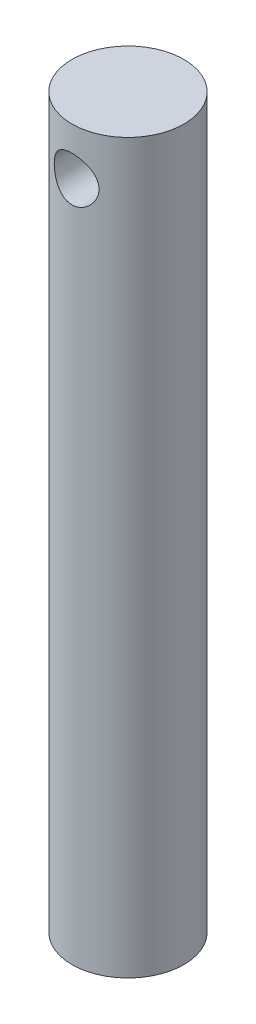
ISO-10303-21;
HEADER;
FILE_DESCRIPTION(('STEP AP214'),'2;1');
FILE_NAME('part.step','',(''),(''),'','','');
FILE_SCHEMA(('AUTOMOTIVE_DESIGN { 1 0 10303 214 1 1 1 1 }'));
ENDSEC;
DATA;
#1=APPLICATION_CONTEXT('core data for automotive mechanical design processes');
#2=APPLICATION_PROTOCOL_DEFINITION('international standard','automotive_design',2000,#1);
#3=PRODUCT_CONTEXT('',#1,'mechanical');
#4=PRODUCT('Part','Part','',(#3));
#5=PRODUCT_RELATED_PRODUCT_CATEGORY('part','',(#4));
#6=PRODUCT_DEFINITION_FORMATION('','',#4);
#7=PRODUCT_DEFINITION_CONTEXT('part definition',#1,'design');
#8=PRODUCT_DEFINITION('design','',#6,#7);
#9=PRODUCT_DEFINITION_SHAPE('','',#8);
#10=(LENGTH_UNIT() NAMED_UNIT(*) SI_UNIT(.MILLI.,.METRE.));
#11=(NAMED_UNIT(*) PLANE_ANGLE_UNIT() SI_UNIT($,.RADIAN.));
#12=(NAMED_UNIT(*) SI_UNIT($,.STERADIAN.) SOLID_ANGLE_UNIT());
#13=UNCERTAINTY_MEASURE_WITH_UNIT(LENGTH_MEASURE(1.E-05),#10,'distance_accuracy_value','');
#14=(GEOMETRIC_REPRESENTATION_CONTEXT(3) GLOBAL_UNCERTAINTY_ASSIGNED_CONTEXT((#13)) GLOBAL_UNIT_ASSIGNED_CONTEXT((#10,
#11,#12)) REPRESENTATION_CONTEXT('',''));
#15=CARTESIAN_POINT('',(0.,0.,0.));
#16=DIRECTION('',(0.,0.,1.));
#17=DIRECTION('',(1.,0.,0.));
#18=AXIS2_PLACEMENT_3D('',#15,#16,#17);
#19=CARTESIAN_POINT('',(0.,130.,0.));
#20=DIRECTION('',(0.,-1.,0.));
#21=DIRECTION('',(0.,0.,-1.));
#22=AXIS2_PLACEMENT_3D('',#19,#20,#21);
#23=CYLINDRICAL_SURFACE('',#22,10.);
#24=CARTESIAN_POINT('',(0.,125.5,-10.));
#25=CARTESIAN_POINT('',(-0.107549581345538,125.499998425067,-9.99999886871264));
#26=CARTESIAN_POINT('',(-0.215132147940364,125.49565632892,-9.99825999367799));
#27=CARTESIAN_POINT('',(-0.429535200549552,125.478326617216,-9.99134740691108));
#28=CARTESIAN_POINT('',(-0.536355162703305,125.465333546597,-9.98617152790588));
#29=CARTESIAN_POINT('',(-0.74863585649742,125.430791965449,-9.97250573560117));
#30=CARTESIAN_POINT('',(-0.854093134440873,125.40922494538,-9.96400865312144));
#31=CARTESIAN_POINT('',(-1.0626676111401,125.357758269563,-9.94393017211574));
#32=CARTESIAN_POINT('',(-1.1657838422726,125.327855233745,-9.932347522545));
#33=CARTESIAN_POINT('',(-1.46979509681069,125.226277191284,-9.89349112162205));
#34=CARTESIAN_POINT('',(-1.66629107461993,125.142578180994,-9.86204458846134));
#35=CARTESIAN_POINT('',(-2.04217417878102,124.94595378265,-9.79113035538708));
#36=CARTESIAN_POINT('',(-2.22156721456799,124.833038539885,-9.75166544086262));
#37=CARTESIAN_POINT('',(-2.56699339938209,124.575531245478,-9.66661825353092));
#38=CARTESIAN_POINT('',(-2.73212223266509,124.429787289424,-9.62084608086599));
#39=CARTESIAN_POINT('',(-3.03635232313264,124.113199390848,-9.52921139577231));
#40=CARTESIAN_POINT('',(-3.17544084661154,123.942343240983,-9.48334885017047));
#41=CARTESIAN_POINT('',(-3.42974847409894,123.571144031434,-9.39445587657958));
#42=CARTESIAN_POINT('',(-3.54362978572887,123.369827073936,-9.35164233015934));
#43=CARTESIAN_POINT('',(-3.73550961465234,122.948927157199,-9.2766729328807));
#44=CARTESIAN_POINT('',(-3.81352517485723,122.729352932259,-9.24451202207145));
#45=CARTESIAN_POINT('',(-3.92779760260542,122.288575344314,-9.19652715590089));
#46=CARTESIAN_POINT('',(-3.96578791979826,122.067897531912,-9.18002840771385));
#47=CARTESIAN_POINT('',(-4.00434593508728,121.622730000323,-9.16328008038142));
#48=CARTESIAN_POINT('',(-4.00493203570087,121.398242209989,-9.16302251073202));
#49=CARTESIAN_POINT('',(-3.9699787321474,120.968486657777,-9.17821000534301));
#50=CARTESIAN_POINT('',(-3.93695062778272,120.762968571234,-9.19256349925666));
#51=CARTESIAN_POINT('',(-3.83989376129508,120.36068088765,-9.23352375055553));
#52=CARTESIAN_POINT('',(-3.77585958980135,120.163912823694,-9.26013264599921));
#53=CARTESIAN_POINT('',(-3.61738946491141,119.779964327708,-9.32318970221162));
#54=CARTESIAN_POINT('',(-3.52235972457939,119.593061521918,-9.35982758573424));
#55=CARTESIAN_POINT('',(-3.30501292151569,119.23716836725,-9.43876232767927));
#56=CARTESIAN_POINT('',(-3.1826856102159,119.068184781187,-9.48106130910411));
#57=CARTESIAN_POINT('',(-2.90310119889356,118.739180542404,-9.57053473488081));
#58=CARTESIAN_POINT('',(-2.74387492593717,118.58086254111,-9.61783329953252));
#59=CARTESIAN_POINT('',(-2.40062885486449,118.292631043994,-9.70919649915615));
#60=CARTESIAN_POINT('',(-2.21660413066998,118.162723205179,-9.75326048890393));
#61=CARTESIAN_POINT('',(-1.82415530521056,117.932765105169,-9.83429362529358));
#62=CARTESIAN_POINT('',(-1.61532098269266,117.833355437606,-9.87110540190899));
#63=CARTESIAN_POINT('',(-1.18204753096606,117.671664277844,-9.93229656657448));
#64=CARTESIAN_POINT('',(-0.9576163936994,117.609363924885,-9.95668226924746));
#65=CARTESIAN_POINT('',(-0.513791775215592,117.527103409161,-9.98912279013839));
#66=CARTESIAN_POINT('',(-0.294886587971143,117.504855091493,-9.99805891667034));
#67=CARTESIAN_POINT('',(0.143690619615703,117.496573798943,-10.0013695702126));
#68=CARTESIAN_POINT('',(0.36336242644818,117.510531436905,-9.99574787164577));
#69=CARTESIAN_POINT('',(0.786865478243651,117.572583505104,-9.97115134127512));
#70=CARTESIAN_POINT('',(0.990964983549757,117.619115960703,-9.95278782691064));
#71=CARTESIAN_POINT('',(1.38827085612275,117.742871416619,-9.90518882810983));
#72=CARTESIAN_POINT('',(1.58147582045412,117.820098359335,-9.87595194712999));
#73=CARTESIAN_POINT('',(1.95815757162884,118.005569879362,-9.80833189541687));
#74=CARTESIAN_POINT('',(2.14115604549353,118.114690944095,-9.76969631959847));
#75=CARTESIAN_POINT('',(2.48688718251039,118.359880647803,-9.68746729490809));
#76=CARTESIAN_POINT('',(2.64961168158684,118.495960085814,-9.64387186219643));
#77=CARTESIAN_POINT('',(2.96144608598878,118.801740025933,-9.55290235277181));
#78=CARTESIAN_POINT('',(3.10894786734726,118.973067083141,-9.50546882853787));
#79=CARTESIAN_POINT('',(3.37350239509235,119.33888016589,-9.4148334583058));
#80=CARTESIAN_POINT('',(3.49055012366591,119.533370000199,-9.37163231039242));
#81=CARTESIAN_POINT('',(3.69161500286277,119.942923389673,-9.2942859982933));
#82=CARTESIAN_POINT('',(3.77530118531766,120.158168000244,-9.2602326182174));
#83=CARTESIAN_POINT('',(3.90459244315908,120.601467301613,-9.20647346903736));
#84=CARTESIAN_POINT('',(3.95022562452798,120.829512404842,-9.1867571119746));
#85=CARTESIAN_POINT('',(3.99943122157417,121.274255809844,-9.16543518780389));
#86=CARTESIAN_POINT('',(4.0057941177721,121.490589701895,-9.16262842667612));
#87=CARTESIAN_POINT('',(3.98360636538274,121.921089692721,-9.17229671415009));
#88=CARTESIAN_POINT('',(3.9550601501471,122.135256063282,-9.18476982225497));
#89=CARTESIAN_POINT('',(3.86614256488129,122.54666446089,-9.2225330048627));
#90=CARTESIAN_POINT('',(3.80707437387706,122.744240846221,-9.2472967218297));
#91=CARTESIAN_POINT('',(3.66001151041638,123.12675696179,-9.30647993934966));
#92=CARTESIAN_POINT('',(3.5720088493455,123.311693185111,-9.34090210615105));
#93=CARTESIAN_POINT('',(3.36374310804133,123.675220410709,-9.41797252826471));
#94=CARTESIAN_POINT('',(3.24192140926543,123.852841830688,-9.46097893410836));
#95=CARTESIAN_POINT('',(2.97179350239177,124.185982142625,-9.54927479921252));
#96=CARTESIAN_POINT('',(2.82347931168581,124.34149434729,-9.59456494363941));
#97=CARTESIAN_POINT('',(2.492974124467,124.636423592531,-9.68587647140964));
#98=CARTESIAN_POINT('',(2.30921017071956,124.774143383982,-9.73175488236393));
#99=CARTESIAN_POINT('',(2.01716584575535,124.956048108938,-9.7949502762577));
#100=CARTESIAN_POINT('',(1.91699501972426,125.012607063853,-9.81509269692655));
#101=CARTESIAN_POINT('',(1.71180110982481,125.117037995405,-9.85294835133019));
#102=CARTESIAN_POINT('',(1.60678027559743,125.164913949808,-9.87066269647665));
#103=CARTESIAN_POINT('',(1.3945464690433,125.250747984685,-9.9028559935491));
#104=CARTESIAN_POINT('',(1.28740777135874,125.288870154747,-9.91738778532477));
#105=CARTESIAN_POINT('',(1.06995577523385,125.355921347721,-9.94319722915714));
#106=CARTESIAN_POINT('',(0.959643983352636,125.38485465735,-9.95447639837582));
#107=CARTESIAN_POINT('',(0.736945215856851,125.433174836149,-9.97343330649399));
#108=CARTESIAN_POINT('',(0.624564263591296,125.452585911645,-9.98112017494336));
#109=CARTESIAN_POINT('',(0.398419132407617,125.481738570666,-9.99270031578293));
#110=CARTESIAN_POINT('',(0.284655994966365,125.491487026834,-9.99659628445551));
#111=CARTESIAN_POINT('',(0.113830463425499,125.498785895573,-9.99951445883957));
#112=CARTESIAN_POINT('',(0.0569198512645336,125.500000833522,-10.0000005987258));
#113=CARTESIAN_POINT('',(0.,125.5,-10.));
#114=B_SPLINE_CURVE_WITH_KNOTS('',3,(#24,#25,#26,#27,#28,#29,#30,#31,#32,#33,#34,#35,#36,#37,
#38,#39,#40,#41,#42,#43,#44,#45,#46,#47,#48,#49,#50,#51,#52,#53,#54,#55,#56,#57,#58,#59,#60,#61,
#62,#63,#64,#65,#66,#67,#68,#69,#70,#71,#72,#73,#74,#75,#76,#77,#78,#79,#80,#81,#82,#83,#84,#85,
#86,#87,#88,#89,#90,#91,#92,#93,#94,#95,#96,#97,#98,#99,#100,#101,#102,#103,#104,#105,#106,#107,
#108,#109,#110,#111,#112,#113),.UNSPECIFIED.,.T.,.F.,(4,2,2,2,2,2,2,2,2,2,2,2,2,2,2,2,2,2,2,2,2,
2,2,2,2,2,2,2,2,2,2,2,2,2,2,2,2,2,2,2,2,2,2,2,4),(0.,0.322603993422159,0.645411604786486,
0.968919914471237,1.29255959093095,1.93701523385824,2.58124739027476,3.25313995292302,
3.92536021760331,4.62749749529941,5.32930078128043,5.99927442509165,6.66891844572484,
7.29195888698823,7.91510806412271,8.55097484497808,9.18708075776543,9.87235930273289,
10.5577741757964,11.2567305822579,11.9553314412776,12.6125760095619,13.2696501904034,
13.8972014302891,14.5248332988777,15.171662586967,15.8187515089811,16.50856181149,
17.1984856998767,17.8950932218183,18.5911857719204,19.2371857868567,19.8831037702627,
20.5034786899772,21.124025035105,21.7801016801356,22.4363763459696,23.1352007896785,
23.4851924266232,23.8350233218042,24.1785111324565,24.52183846562,24.8642884495951,
25.2064946871486,25.3772305569977),.UNSPECIFIED.);
#115=CARTESIAN_POINT('',(0.,125.5,-10.));
#116=VERTEX_POINT('',#115);
#117=EDGE_CURVE('E32',#116,#116,#114,.T.);
#118=ORIENTED_EDGE('',*,*,#117,.T.);
#119=EDGE_LOOP('',(#118));
#120=FACE_BOUND('',#119,.T.);
#121=CARTESIAN_POINT('',(4.,121.5,9.16515138991168));
#122=CARTESIAN_POINT('',(3.99999917996685,121.392822503216,9.16515220722506));
#123=CARTESIAN_POINT('',(3.99568627578832,121.285612140205,9.16703782704588));
#124=CARTESIAN_POINT('',(3.97847804504316,121.071967905829,9.17451890581268));
#125=CARTESIAN_POINT('',(3.965577465543,120.965534550055,9.18011663538446));
#126=CARTESIAN_POINT('',(3.9312935770878,120.754064046644,9.19485078616074));
#127=CARTESIAN_POINT('',(3.90989336356572,120.649030115151,9.20399425848326));
#128=CARTESIAN_POINT('',(3.85883937208579,120.44131240281,9.2255144619826));
#129=CARTESIAN_POINT('',(3.82918216740128,120.338629616898,9.23789253541712));
#130=CARTESIAN_POINT('',(3.72849978450445,120.036010273371,9.27920231487636));
#131=CARTESIAN_POINT('',(3.64559228099563,119.840462079036,9.31238810193525));
#132=CARTESIAN_POINT('',(3.45083256453888,119.466198731327,9.38629512671437));
#133=CARTESIAN_POINT('',(3.33898667159604,119.287479914109,9.42701471853534));
#134=CARTESIAN_POINT('',(3.08264624953203,118.941488186399,9.51401677460926));
#135=CARTESIAN_POINT('',(2.93675933272146,118.775289566711,9.56047821792022));
#136=CARTESIAN_POINT('',(2.61941759406606,118.468939591958,9.65224928088017));
#137=CARTESIAN_POINT('',(2.44795387495429,118.328797339245,9.69755849326326));
#138=CARTESIAN_POINT('',(2.07601279575004,118.073187890163,9.78406811808173));
#139=CARTESIAN_POINT('',(1.87465797803874,117.958911580031,9.82503606295845));
#140=CARTESIAN_POINT('',(1.45365059895514,117.766312680323,9.89607856333948));
#141=CARTESIAN_POINT('',(1.23400552632834,117.687975460567,9.92615755049622));
#142=CARTESIAN_POINT('',(0.793932865332423,117.573317072677,9.97076649749865));
#143=CARTESIAN_POINT('',(0.574057972725518,117.535145384002,9.98597873479395));
#144=CARTESIAN_POINT('',(0.130532654160153,117.495943016499,10.001606214367));
#145=CARTESIAN_POINT('',(-0.0931163324631254,117.494898484956,10.0020269755724));
#146=CARTESIAN_POINT('',(-0.524464988663938,117.528965542546,9.98843925626005));
#147=CARTESIAN_POINT('',(-0.732354905542466,117.562049546297,9.97523993538891));
#148=CARTESIAN_POINT('',(-1.13934621864231,117.659985751818,9.93698582942363));
#149=CARTESIAN_POINT('',(-1.33844696883604,117.724840284584,9.91193017443785));
#150=CARTESIAN_POINT('',(-1.72579587696676,117.885272965972,9.85193648913816));
#151=CARTESIAN_POINT('',(-1.9138352467432,117.981299429689,9.81685520932147));
#152=CARTESIAN_POINT('',(-2.27161630149723,118.20093001378,9.7402917036085));
#153=CARTESIAN_POINT('',(-2.44135168543996,118.324543586184,9.69880728534381));
#154=CARTESIAN_POINT('',(-2.76953765597607,118.605298271905,9.61043274352156));
#155=CARTESIAN_POINT('',(-2.9265156905315,118.76410778515,9.56336653023493));
#156=CARTESIAN_POINT('',(-3.21221483078646,119.105981143659,9.47123321946549));
#157=CARTESIAN_POINT('',(-3.34092668757429,119.28905289639,9.42616678016159));
#158=CARTESIAN_POINT('',(-3.56980837743823,119.680838044749,9.34193794818039));
#159=CARTESIAN_POINT('',(-3.66906930327244,119.890129660678,9.30297828115413));
#160=CARTESIAN_POINT('',(-3.83035251973301,120.324430980624,9.23775180688171));
#161=CARTESIAN_POINT('',(-3.89239899675599,120.549430369453,9.21147675782622));
#162=CARTESIAN_POINT('',(-3.97390989770977,120.994071554935,9.17659519405432));
#163=CARTESIAN_POINT('',(-3.99574419362908,121.213200894257,9.16700732912275));
#164=CARTESIAN_POINT('',(-4.00312265288578,121.652154415519,9.16378995738077));
#165=CARTESIAN_POINT('',(-3.98867782118258,121.871978366551,9.17015561120724));
#166=CARTESIAN_POINT('',(-3.92606578958006,122.292917869914,9.19712088718227));
#167=CARTESIAN_POINT('',(-3.87986612404772,122.4943858748,9.21688915596603));
#168=CARTESIAN_POINT('',(-3.75760837382176,122.886576809571,9.26740102054679));
#169=CARTESIAN_POINT('',(-3.68154366860459,123.077297346215,9.29814704977195));
#170=CARTESIAN_POINT('',(-3.49827127896311,123.451204715591,9.36867563720203));
#171=CARTESIAN_POINT('',(-3.38992573652915,123.633772377387,9.40877409278357));
#172=CARTESIAN_POINT('',(-3.1463304488838,123.978965974885,9.49300770315587));
#173=CARTESIAN_POINT('',(-3.01106974696435,124.141583745598,9.5371444979208));
#174=CARTESIAN_POINT('',(-2.70568842336056,124.454746817191,9.62841831942843));
#175=CARTESIAN_POINT('',(-2.53373085888855,124.603513130555,9.67553614570507));
#176=CARTESIAN_POINT('',(-2.16616726673934,124.870354153248,9.76439589135024));
#177=CARTESIAN_POINT('',(-1.97056027694192,124.988427613297,9.80613759186121));
#178=CARTESIAN_POINT('',(-1.56055986799732,125.190095252819,9.87967431800929));
#179=CARTESIAN_POINT('',(-1.346170961965,125.273697687947,9.9114717248188));
#180=CARTESIAN_POINT('',(-0.904787181861567,125.403097705199,9.96145426937249));
#181=CARTESIAN_POINT('',(-0.677799220674797,125.448915804313,9.97964679410119));
#182=CARTESIAN_POINT('',(-0.233633020611972,125.499009401911,9.99958016425668));
#183=CARTESIAN_POINT('',(-0.0167809848943009,125.505800252077,10.0023169350655));
#184=CARTESIAN_POINT('',(0.414867671174727,125.48428904628,9.99372084740381));
#185=CARTESIAN_POINT('',(0.629664597702891,125.455992302479,9.98239011871255));
#186=CARTESIAN_POINT('',(1.04434180494581,125.366906405787,9.94743026789157));
#187=CARTESIAN_POINT('',(1.24447761316991,125.307142043495,9.92418961491738));
#188=CARTESIAN_POINT('',(1.63184470564405,125.157894455242,9.86789895440955));
#189=CARTESIAN_POINT('',(1.81907360209112,125.068405747944,9.83484713776136));
#190=CARTESIAN_POINT('',(2.18440609879393,124.857793352432,9.76036189588764));
#191=CARTESIAN_POINT('',(2.3617408310488,124.735446455904,9.71862262764552));
#192=CARTESIAN_POINT('',(2.69410799958838,124.464423916364,9.63178803063432));
#193=CARTESIAN_POINT('',(2.849131156699,124.315737375961,9.58669131729773));
#194=CARTESIAN_POINT('',(3.14240275826141,123.985365761134,9.49475540255923));
#195=CARTESIAN_POINT('',(3.27901865020172,123.802207701298,9.4479811565371));
#196=CARTESIAN_POINT('',(3.51969402497222,123.414130278752,9.36099292501489));
#197=CARTESIAN_POINT('',(3.62374968011083,123.209208361334,9.32077971107738));
#198=CARTESIAN_POINT('',(3.78798515690828,122.80187605622,9.25517900642369));
#199=CARTESIAN_POINT('',(3.85126569346866,122.600892324054,9.22878451494603));
#200=CARTESIAN_POINT('',(3.92194632104984,122.293361040209,9.1988556584339));
#201=CARTESIAN_POINT('',(3.94146052144919,122.189926964106,9.19049270633767));
#202=CARTESIAN_POINT('',(3.97228850679684,121.981643070389,9.17721200341611));
#203=CARTESIAN_POINT('',(3.98360705155155,121.876794110604,9.17229225293171));
#204=CARTESIAN_POINT('',(3.99384232103284,121.726449408648,9.16783675423417));
#205=CARTESIAN_POINT('',(3.99615058414994,121.681200169678,9.16683059815414));
#206=CARTESIAN_POINT('',(3.99922965337524,121.590635915785,9.16548771864777));
#207=CARTESIAN_POINT('',(4.00000034675784,121.545320896284,9.16515104430392));
#208=CARTESIAN_POINT('',(4.,121.5,9.16515138991168));
#209=B_SPLINE_CURVE_WITH_KNOTS('',3,(#121,#122,#123,#124,#125,#126,#127,#128,#129,#130,#131,
#132,#133,#134,#135,#136,#137,#138,#139,#140,#141,#142,#143,#144,#145,#146,#147,#148,#149,#150,
#151,#152,#153,#154,#155,#156,#157,#158,#159,#160,#161,#162,#163,#164,#165,#166,#167,#168,#169,
#170,#171,#172,#173,#174,#175,#176,#177,#178,#179,#180,#181,#182,#183,#184,#185,#186,#187,#188,
#189,#190,#191,#192,#193,#194,#195,#196,#197,#198,#199,#200,#201,#202,#203,#204,#205,#206,#207,
#208),.UNSPECIFIED.,.T.,.F.,(4,2,2,2,2,2,2,2,2,2,2,2,2,2,2,2,2,2,2,2,2,2,2,2,2,2,2,2,2,2,2,2,2,
2,2,2,2,2,2,2,2,2,2,4),(0.,0.321486083338399,0.643168995111192,0.965494918272702,
1.28795480954364,1.92974178448593,2.57138871437638,3.24631250358764,3.92147162486599,
4.62325351972771,5.32474947728876,5.99228379564282,6.65956904401259,7.28937303450521,
7.91922324048035,8.55856614259711,9.19812843669978,9.87968101952628,10.5614562804417,
11.2624893122443,11.9630662339012,12.6208430883876,13.2784204360579,13.898545099602,
14.5188073109319,15.1642232309532,15.8099024284161,16.5032748228388,17.1966754349541,
17.8899098841554,18.5827676569819,19.2304209330182,19.8779761681512,20.5056400267662,
21.1334196944709,21.7889411606977,22.4447344691833,23.1411252036114,23.8375977730829,
24.4715333542807,24.7879924179097,25.1042675432749,25.240200643082,25.3761437083411),.UNSPECIFIED.);
#210=CARTESIAN_POINT('',(4.,121.5,9.16515138991168));
#211=VERTEX_POINT('',#210);
#212=EDGE_CURVE('E45',#211,#211,#209,.T.);
#213=ORIENTED_EDGE('',*,*,#212,.T.);
#214=EDGE_LOOP('',(#213));
#215=FACE_BOUND('',#214,.T.);
#216=CARTESIAN_POINT('',(0.,130.,0.));
#217=DIRECTION('',(0.,1.,0.));
#218=DIRECTION('',(0.,0.,1.));
#219=AXIS2_PLACEMENT_3D('',#216,#217,#218);
#220=CIRCLE('',#219,10.);
#221=CARTESIAN_POINT('',(0.,130.,10.));
#222=VERTEX_POINT('',#221);
#223=EDGE_CURVE('E10',#222,#222,#220,.T.);
#224=ORIENTED_EDGE('',*,*,#223,.F.);
#225=EDGE_LOOP('',(#224));
#226=FACE_BOUND('',#225,.T.);
#227=CARTESIAN_POINT('',(0.,0.,0.));
#228=DIRECTION('',(0.,1.,0.));
#229=DIRECTION('',(0.,0.,1.));
#230=AXIS2_PLACEMENT_3D('',#227,#228,#229);
#231=CIRCLE('',#230,10.);
#232=CARTESIAN_POINT('',(0.,0.,10.));
#233=VERTEX_POINT('',#232);
#234=EDGE_CURVE('E39',#233,#233,#231,.T.);
#235=ORIENTED_EDGE('',*,*,#234,.T.);
#236=EDGE_LOOP('',(#235));
#237=FACE_BOUND('',#236,.T.);
#238=ADVANCED_FACE('F28',(#120,#215,#226,#237),#23,.T.);
#239=CARTESIAN_POINT('',(0.,130.,0.));
#240=DIRECTION('',(0.,1.,0.));
#241=DIRECTION('',(0.,0.,1.));
#242=AXIS2_PLACEMENT_3D('',#239,#240,#241);
#243=PLANE('',#242);
#244=ORIENTED_EDGE('',*,*,#223,.T.);
#245=EDGE_LOOP('',(#244));
#246=FACE_BOUND('',#245,.T.);
#247=ADVANCED_FACE('F55',(#246),#243,.T.);
#248=CARTESIAN_POINT('',(0.,0.,0.));
#249=DIRECTION('',(0.,1.,0.));
#250=DIRECTION('',(0.,0.,1.));
#251=AXIS2_PLACEMENT_3D('',#248,#249,#250);
#252=PLANE('',#251);
#253=ORIENTED_EDGE('',*,*,#234,.F.);
#254=EDGE_LOOP('',(#253));
#255=FACE_BOUND('',#254,.T.);
#256=ADVANCED_FACE('F53',(#255),#252,.F.);
#257=CARTESIAN_POINT('',(0.,121.5,-25.));
#258=DIRECTION('',(0.,0.,1.));
#259=DIRECTION('',(1.,0.,0.));
#260=AXIS2_PLACEMENT_3D('',#257,#258,#259);
#261=CYLINDRICAL_SURFACE('',#260,4.);
#262=ORIENTED_EDGE('',*,*,#212,.F.);
#263=EDGE_LOOP('',(#262));
#264=FACE_BOUND('',#263,.T.);
#265=ORIENTED_EDGE('',*,*,#117,.F.);
#266=EDGE_LOOP('',(#265));
#267=FACE_BOUND('',#266,.T.);
#268=ADVANCED_FACE('F49',(#264,#267),#261,.F.);
#269=CLOSED_SHELL('',(#238,#247,#256,#268));
#270=MANIFOLD_SOLID_BREP('B2',#269);
#271=ADVANCED_BREP_SHAPE_REPRESENTATION('',(#18,#270),#14);
#272=SHAPE_DEFINITION_REPRESENTATION(#9,#271);
ENDSEC;
END-ISO-10303-21;
